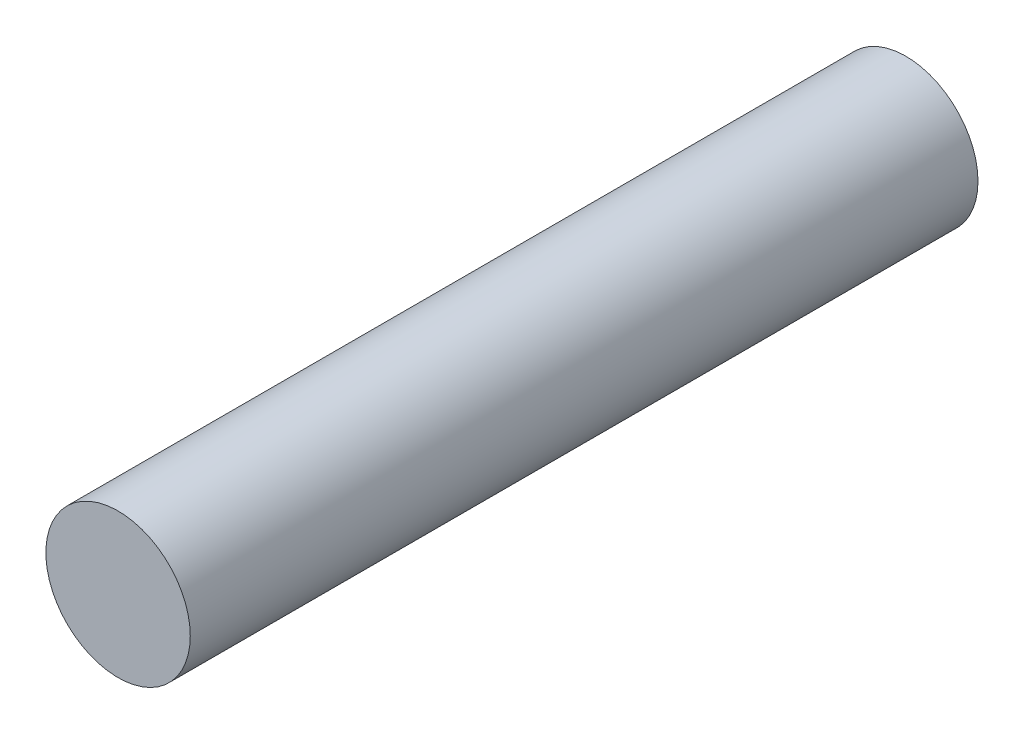
ISO-10303-21;
HEADER;
FILE_DESCRIPTION(('STEP AP214'),'2;1');
FILE_NAME('part.step','',(''),(''),'','','');
FILE_SCHEMA(('AUTOMOTIVE_DESIGN { 1 0 10303 214 1 1 1 1 }'));
ENDSEC;
DATA;
#1=APPLICATION_CONTEXT('core data for automotive mechanical design processes');
#2=APPLICATION_PROTOCOL_DEFINITION('international standard','automotive_design',2000,#1);
#3=PRODUCT_CONTEXT('',#1,'mechanical');
#4=PRODUCT('Part','Part','',(#3));
#5=PRODUCT_RELATED_PRODUCT_CATEGORY('part','',(#4));
#6=PRODUCT_DEFINITION_FORMATION('','',#4);
#7=PRODUCT_DEFINITION_CONTEXT('part definition',#1,'design');
#8=PRODUCT_DEFINITION('design','',#6,#7);
#9=PRODUCT_DEFINITION_SHAPE('','',#8);
#10=(LENGTH_UNIT() NAMED_UNIT(*) SI_UNIT(.MILLI.,.METRE.));
#11=(NAMED_UNIT(*) PLANE_ANGLE_UNIT() SI_UNIT($,.RADIAN.));
#12=(NAMED_UNIT(*) SI_UNIT($,.STERADIAN.) SOLID_ANGLE_UNIT());
#13=UNCERTAINTY_MEASURE_WITH_UNIT(LENGTH_MEASURE(1.E-05),#10,'distance_accuracy_value','');
#14=(GEOMETRIC_REPRESENTATION_CONTEXT(3) GLOBAL_UNCERTAINTY_ASSIGNED_CONTEXT((#13)) GLOBAL_UNIT_ASSIGNED_CONTEXT((#10,
#11,#12)) REPRESENTATION_CONTEXT('',''));
#15=CARTESIAN_POINT('',(0.,0.,0.));
#16=DIRECTION('',(0.,0.,1.));
#17=DIRECTION('',(1.,0.,0.));
#18=AXIS2_PLACEMENT_3D('',#15,#16,#17);
#19=CARTESIAN_POINT('',(0.,0.,60.));
#20=DIRECTION('',(0.,0.,-1.));
#21=DIRECTION('',(-1.,0.,0.));
#22=AXIS2_PLACEMENT_3D('',#19,#20,#21);
#23=CYLINDRICAL_SURFACE('',#22,5.5);
#24=CARTESIAN_POINT('',(0.,0.,60.));
#25=DIRECTION('',(0.,0.,1.));
#26=DIRECTION('',(1.,0.,0.));
#27=AXIS2_PLACEMENT_3D('',#24,#25,#26);
#28=CIRCLE('',#27,5.5);
#29=CARTESIAN_POINT('',(5.5,0.,60.));
#30=VERTEX_POINT('',#29);
#31=EDGE_CURVE('E10',#30,#30,#28,.T.);
#32=ORIENTED_EDGE('',*,*,#31,.F.);
#33=EDGE_LOOP('',(#32));
#34=FACE_BOUND('',#33,.T.);
#35=CARTESIAN_POINT('',(0.,0.,0.));
#36=DIRECTION('',(0.,0.,1.));
#37=DIRECTION('',(1.,0.,0.));
#38=AXIS2_PLACEMENT_3D('',#35,#36,#37);
#39=CIRCLE('',#38,5.5);
#40=CARTESIAN_POINT('',(5.5,0.,0.));
#41=VERTEX_POINT('',#40);
#42=EDGE_CURVE('E44',#41,#41,#39,.T.);
#43=ORIENTED_EDGE('',*,*,#42,.T.);
#44=EDGE_LOOP('',(#43));
#45=FACE_BOUND('',#44,.T.);
#46=ADVANCED_FACE('F41',(#34,#45),#23,.T.);
#47=CARTESIAN_POINT('',(0.,0.,60.));
#48=DIRECTION('',(0.,0.,1.));
#49=DIRECTION('',(1.,0.,0.));
#50=AXIS2_PLACEMENT_3D('',#47,#48,#49);
#51=PLANE('',#50);
#52=ORIENTED_EDGE('',*,*,#31,.T.);
#53=EDGE_LOOP('',(#52));
#54=FACE_BOUND('',#53,.T.);
#55=ADVANCED_FACE('F58',(#54),#51,.T.);
#56=CARTESIAN_POINT('',(0.,0.,0.));
#57=DIRECTION('',(0.,0.,1.));
#58=DIRECTION('',(1.,0.,0.));
#59=AXIS2_PLACEMENT_3D('',#56,#57,#58);
#60=PLANE('',#59);
#61=ORIENTED_EDGE('',*,*,#42,.F.);
#62=EDGE_LOOP('',(#61));
#63=FACE_BOUND('',#62,.T.);
#64=ADVANCED_FACE('F56',(#63),#60,.F.);
#65=CLOSED_SHELL('',(#46,#55,#64));
#66=MANIFOLD_SOLID_BREP('B2',#65);
#67=ADVANCED_BREP_SHAPE_REPRESENTATION('',(#18,#66),#14);
#68=SHAPE_DEFINITION_REPRESENTATION(#9,#67);
ENDSEC;
END-ISO-10303-21;
